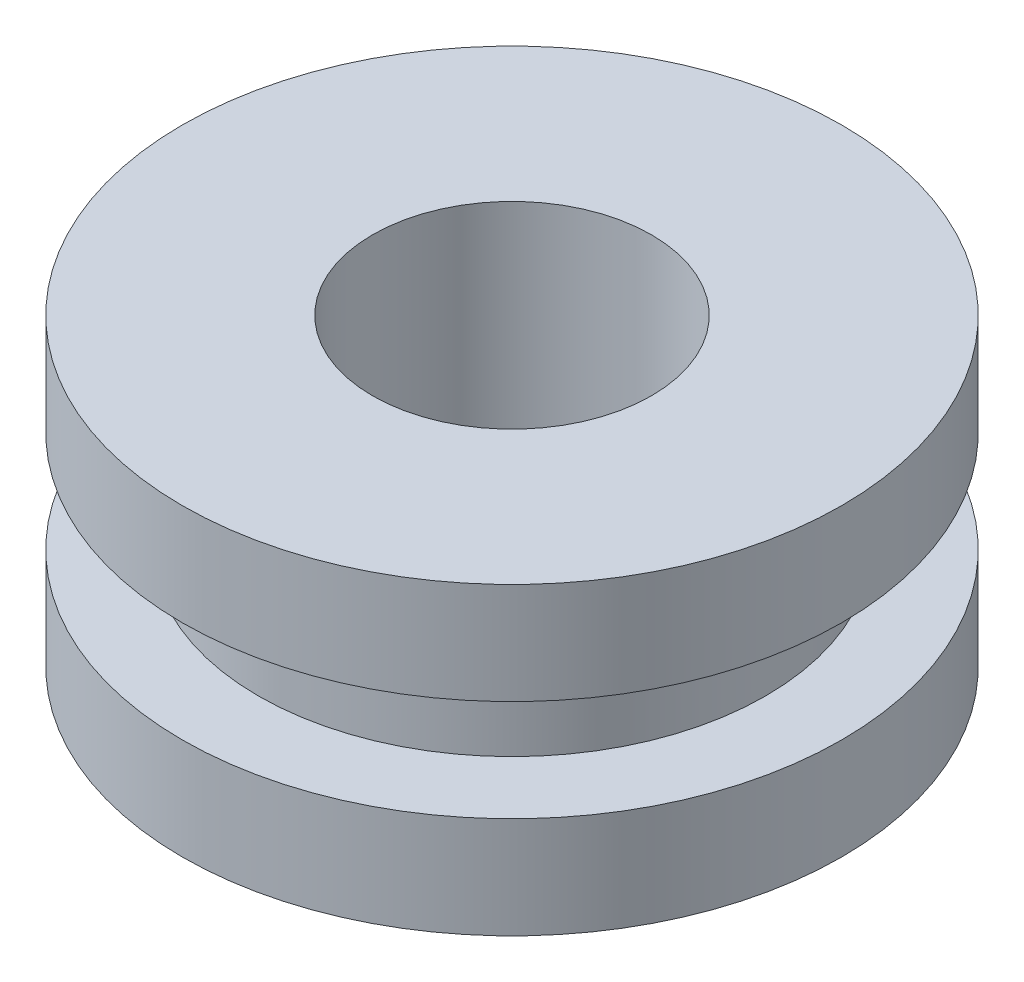
ISO-10303-21;
HEADER;
FILE_DESCRIPTION(('STEP AP214'),'2;1');
FILE_NAME('part.step','',(''),(''),'','','');
FILE_SCHEMA(('AUTOMOTIVE_DESIGN { 1 0 10303 214 1 1 1 1 }'));
ENDSEC;
DATA;
#1=APPLICATION_CONTEXT('core data for automotive mechanical design processes');
#2=APPLICATION_PROTOCOL_DEFINITION('international standard','automotive_design',2000,#1);
#3=PRODUCT_CONTEXT('',#1,'mechanical');
#4=PRODUCT('Part','Part','',(#3));
#5=PRODUCT_RELATED_PRODUCT_CATEGORY('part','',(#4));
#6=PRODUCT_DEFINITION_FORMATION('','',#4);
#7=PRODUCT_DEFINITION_CONTEXT('part definition',#1,'design');
#8=PRODUCT_DEFINITION('design','',#6,#7);
#9=PRODUCT_DEFINITION_SHAPE('','',#8);
#10=(LENGTH_UNIT() NAMED_UNIT(*) SI_UNIT(.MILLI.,.METRE.));
#11=(NAMED_UNIT(*) PLANE_ANGLE_UNIT() SI_UNIT($,.RADIAN.));
#12=(NAMED_UNIT(*) SI_UNIT($,.STERADIAN.) SOLID_ANGLE_UNIT());
#13=UNCERTAINTY_MEASURE_WITH_UNIT(LENGTH_MEASURE(1.E-05),#10,'distance_accuracy_value','');
#14=(GEOMETRIC_REPRESENTATION_CONTEXT(3) GLOBAL_UNCERTAINTY_ASSIGNED_CONTEXT((#13)) GLOBAL_UNIT_ASSIGNED_CONTEXT((#10,
#11,#12)) REPRESENTATION_CONTEXT('',''));
#15=CARTESIAN_POINT('',(0.,0.,0.));
#16=DIRECTION('',(0.,0.,1.));
#17=DIRECTION('',(1.,0.,0.));
#18=AXIS2_PLACEMENT_3D('',#15,#16,#17);
#19=CARTESIAN_POINT('',(0.,2.,0.));
#20=DIRECTION('',(0.,-1.,0.));
#21=DIRECTION('',(0.,0.,-1.));
#22=AXIS2_PLACEMENT_3D('',#19,#20,#21);
#23=CYLINDRICAL_SURFACE('',#22,6.5);
#24=CARTESIAN_POINT('',(0.,2.,0.));
#25=DIRECTION('',(0.,1.,0.));
#26=DIRECTION('',(0.,0.,1.));
#27=AXIS2_PLACEMENT_3D('',#24,#25,#26);
#28=CIRCLE('',#27,6.5);
#29=CARTESIAN_POINT('',(0.,2.,6.5));
#30=VERTEX_POINT('',#29);
#31=EDGE_CURVE('E50',#30,#30,#28,.T.);
#32=ORIENTED_EDGE('',*,*,#31,.F.);
#33=EDGE_LOOP('',(#32));
#34=FACE_BOUND('',#33,.T.);
#35=CARTESIAN_POINT('',(0.,0.,0.));
#36=DIRECTION('',(0.,1.,0.));
#37=DIRECTION('',(0.,0.,1.));
#38=AXIS2_PLACEMENT_3D('',#35,#36,#37);
#39=CIRCLE('',#38,6.5);
#40=CARTESIAN_POINT('',(0.,0.,6.5));
#41=VERTEX_POINT('',#40);
#42=EDGE_CURVE('E45',#41,#41,#39,.T.);
#43=ORIENTED_EDGE('',*,*,#42,.T.);
#44=EDGE_LOOP('',(#43));
#45=FACE_BOUND('',#44,.T.);
#46=ADVANCED_FACE('F42',(#34,#45),#23,.T.);
#47=CARTESIAN_POINT('',(0.,2.,0.));
#48=DIRECTION('',(0.,1.,0.));
#49=DIRECTION('',(0.,0.,1.));
#50=AXIS2_PLACEMENT_3D('',#47,#48,#49);
#51=PLANE('',#50);
#52=CARTESIAN_POINT('',(0.,2.,0.));
#53=DIRECTION('',(0.,1.,0.));
#54=DIRECTION('',(0.,0.,1.));
#55=AXIS2_PLACEMENT_3D('',#52,#53,#54);
#56=CIRCLE('',#55,5.);
#57=CARTESIAN_POINT('',(0.,2.,5.));
#58=VERTEX_POINT('',#57);
#59=EDGE_CURVE('E10',#58,#58,#56,.T.);
#60=ORIENTED_EDGE('',*,*,#59,.F.);
#61=EDGE_LOOP('',(#60));
#62=FACE_BOUND('',#61,.T.);
#63=ORIENTED_EDGE('',*,*,#31,.T.);
#64=EDGE_LOOP('',(#63));
#65=FACE_BOUND('',#64,.T.);
#66=ADVANCED_FACE('F107',(#62,#65),#51,.T.);
#67=CARTESIAN_POINT('',(0.,0.,0.));
#68=DIRECTION('',(0.,1.,0.));
#69=DIRECTION('',(0.,0.,1.));
#70=AXIS2_PLACEMENT_3D('',#67,#68,#69);
#71=PLANE('',#70);
#72=CARTESIAN_POINT('',(0.,0.,0.));
#73=DIRECTION('',(0.,1.,0.));
#74=DIRECTION('',(0.,0.,1.));
#75=AXIS2_PLACEMENT_3D('',#72,#73,#74);
#76=CIRCLE('',#75,2.75);
#77=CARTESIAN_POINT('',(0.,0.,2.75));
#78=VERTEX_POINT('',#77);
#79=EDGE_CURVE('E68',#78,#78,#76,.T.);
#80=ORIENTED_EDGE('',*,*,#79,.T.);
#81=EDGE_LOOP('',(#80));
#82=FACE_BOUND('',#81,.T.);
#83=ORIENTED_EDGE('',*,*,#42,.F.);
#84=EDGE_LOOP('',(#83));
#85=FACE_BOUND('',#84,.T.);
#86=ADVANCED_FACE('F112',(#82,#85),#71,.F.);
#87=CARTESIAN_POINT('',(0.,3.,0.));
#88=DIRECTION('',(0.,-1.,0.));
#89=DIRECTION('',(0.,0.,-1.));
#90=AXIS2_PLACEMENT_3D('',#87,#88,#89);
#91=CYLINDRICAL_SURFACE('',#90,5.);
#92=ORIENTED_EDGE('',*,*,#59,.T.);
#93=EDGE_LOOP('',(#92));
#94=FACE_BOUND('',#93,.T.);
#95=CARTESIAN_POINT('',(0.,4.,0.));
#96=DIRECTION('',(0.,1.,0.));
#97=DIRECTION('',(0.,0.,1.));
#98=AXIS2_PLACEMENT_3D('',#95,#96,#97);
#99=CIRCLE('',#98,5.);
#100=CARTESIAN_POINT('',(0.,4.,5.));
#101=VERTEX_POINT('',#100);
#102=EDGE_CURVE('E59',#101,#101,#99,.T.);
#103=ORIENTED_EDGE('',*,*,#102,.F.);
#104=EDGE_LOOP('',(#103));
#105=FACE_BOUND('',#104,.T.);
#106=ADVANCED_FACE('F94',(#94,#105),#91,.T.);
#107=CARTESIAN_POINT('',(0.,6.,0.));
#108=DIRECTION('',(0.,-1.,0.));
#109=DIRECTION('',(0.,0.,-1.));
#110=AXIS2_PLACEMENT_3D('',#107,#108,#109);
#111=CYLINDRICAL_SURFACE('',#110,6.5);
#112=CARTESIAN_POINT('',(0.,6.,0.));
#113=DIRECTION('',(0.,1.,0.));
#114=DIRECTION('',(0.,0.,1.));
#115=AXIS2_PLACEMENT_3D('',#112,#113,#114);
#116=CIRCLE('',#115,6.5);
#117=CARTESIAN_POINT('',(0.,6.,6.5));
#118=VERTEX_POINT('',#117);
#119=EDGE_CURVE('E63',#118,#118,#116,.T.);
#120=ORIENTED_EDGE('',*,*,#119,.F.);
#121=EDGE_LOOP('',(#120));
#122=FACE_BOUND('',#121,.T.);
#123=CARTESIAN_POINT('',(0.,4.,0.));
#124=DIRECTION('',(0.,1.,0.));
#125=DIRECTION('',(0.,0.,1.));
#126=AXIS2_PLACEMENT_3D('',#123,#124,#125);
#127=CIRCLE('',#126,6.5);
#128=CARTESIAN_POINT('',(0.,4.,6.5));
#129=VERTEX_POINT('',#128);
#130=EDGE_CURVE('E64',#129,#129,#127,.T.);
#131=ORIENTED_EDGE('',*,*,#130,.T.);
#132=EDGE_LOOP('',(#131));
#133=FACE_BOUND('',#132,.T.);
#134=ADVANCED_FACE('F88',(#122,#133),#111,.T.);
#135=CARTESIAN_POINT('',(0.,6.,0.));
#136=DIRECTION('',(0.,1.,0.));
#137=DIRECTION('',(0.,0.,1.));
#138=AXIS2_PLACEMENT_3D('',#135,#136,#137);
#139=PLANE('',#138);
#140=CARTESIAN_POINT('',(0.,6.,0.));
#141=DIRECTION('',(0.,1.,0.));
#142=DIRECTION('',(0.,0.,1.));
#143=AXIS2_PLACEMENT_3D('',#140,#141,#142);
#144=CIRCLE('',#143,2.75);
#145=CARTESIAN_POINT('',(0.,6.,2.75));
#146=VERTEX_POINT('',#145);
#147=EDGE_CURVE('E75',#146,#146,#144,.T.);
#148=ORIENTED_EDGE('',*,*,#147,.F.);
#149=EDGE_LOOP('',(#148));
#150=FACE_BOUND('',#149,.T.);
#151=ORIENTED_EDGE('',*,*,#119,.T.);
#152=EDGE_LOOP('',(#151));
#153=FACE_BOUND('',#152,.T.);
#154=ADVANCED_FACE('F84',(#150,#153),#139,.T.);
#155=CARTESIAN_POINT('',(0.,4.,0.));
#156=DIRECTION('',(0.,1.,0.));
#157=DIRECTION('',(0.,0.,1.));
#158=AXIS2_PLACEMENT_3D('',#155,#156,#157);
#159=PLANE('',#158);
#160=ORIENTED_EDGE('',*,*,#102,.T.);
#161=EDGE_LOOP('',(#160));
#162=FACE_BOUND('',#161,.T.);
#163=ORIENTED_EDGE('',*,*,#130,.F.);
#164=EDGE_LOOP('',(#163));
#165=FACE_BOUND('',#164,.T.);
#166=ADVANCED_FACE('F87',(#162,#165),#159,.F.);
#167=CARTESIAN_POINT('',(0.,6.,0.));
#168=DIRECTION('',(0.,1.,0.));
#169=DIRECTION('',(0.,0.,1.));
#170=AXIS2_PLACEMENT_3D('',#167,#168,#169);
#171=CYLINDRICAL_SURFACE('',#170,2.75);
#172=ORIENTED_EDGE('',*,*,#79,.F.);
#173=EDGE_LOOP('',(#172));
#174=FACE_BOUND('',#173,.T.);
#175=ORIENTED_EDGE('',*,*,#147,.T.);
#176=EDGE_LOOP('',(#175));
#177=FACE_BOUND('',#176,.T.);
#178=ADVANCED_FACE('F82',(#174,#177),#171,.F.);
#179=CLOSED_SHELL('',(#46,#66,#86,#106,#134,#154,#166,#178));
#180=MANIFOLD_SOLID_BREP('B2',#179);
#181=ADVANCED_BREP_SHAPE_REPRESENTATION('',(#18,#180),#14);
#182=SHAPE_DEFINITION_REPRESENTATION(#9,#181);
ENDSEC;
END-ISO-10303-21;
